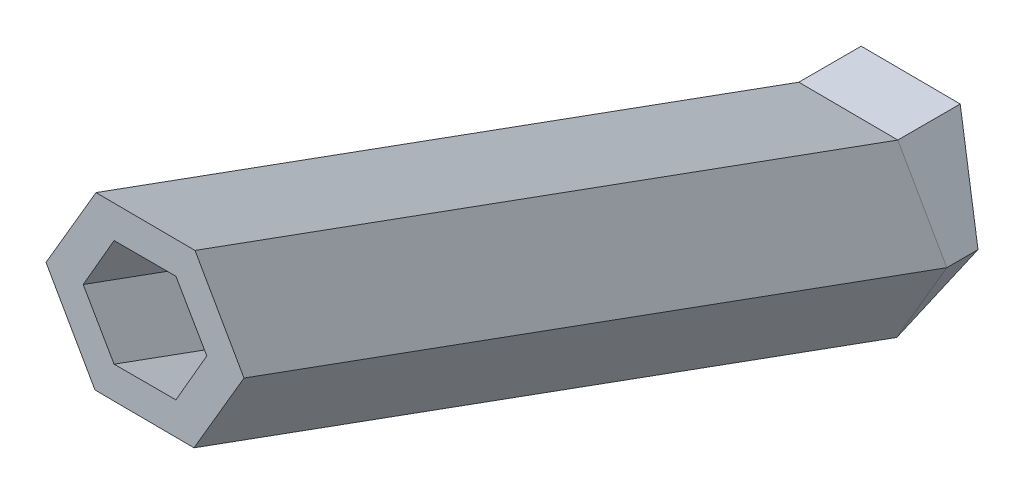
ISO-10303-21;
HEADER;
FILE_DESCRIPTION(('STEP AP214'),'2;1');
FILE_NAME('part.step','',(''),(''),'','','');
FILE_SCHEMA(('AUTOMOTIVE_DESIGN { 1 0 10303 214 1 1 1 1 }'));
ENDSEC;
DATA;
#1=APPLICATION_CONTEXT('core data for automotive mechanical design processes');
#2=APPLICATION_PROTOCOL_DEFINITION('international standard','automotive_design',2000,#1);
#3=PRODUCT_CONTEXT('',#1,'mechanical');
#4=PRODUCT('Part','Part','',(#3));
#5=PRODUCT_RELATED_PRODUCT_CATEGORY('part','',(#4));
#6=PRODUCT_DEFINITION_FORMATION('','',#4);
#7=PRODUCT_DEFINITION_CONTEXT('part definition',#1,'design');
#8=PRODUCT_DEFINITION('design','',#6,#7);
#9=PRODUCT_DEFINITION_SHAPE('','',#8);
#10=(LENGTH_UNIT() NAMED_UNIT(*) SI_UNIT(.MILLI.,.METRE.));
#11=(NAMED_UNIT(*) PLANE_ANGLE_UNIT() SI_UNIT($,.RADIAN.));
#12=(NAMED_UNIT(*) SI_UNIT($,.STERADIAN.) SOLID_ANGLE_UNIT());
#13=UNCERTAINTY_MEASURE_WITH_UNIT(LENGTH_MEASURE(1.E-05),#10,'distance_accuracy_value','');
#14=(GEOMETRIC_REPRESENTATION_CONTEXT(3) GLOBAL_UNCERTAINTY_ASSIGNED_CONTEXT((#13)) GLOBAL_UNIT_ASSIGNED_CONTEXT((#10,
#11,#12)) REPRESENTATION_CONTEXT('',''));
#15=CARTESIAN_POINT('',(0.,0.,0.));
#16=DIRECTION('',(0.,0.,1.));
#17=DIRECTION('',(1.,0.,0.));
#18=AXIS2_PLACEMENT_3D('',#15,#16,#17);
#19=CARTESIAN_POINT('',(3.64119484408319,-6.08441680588479,-28.1152363360501));
#20=DIRECTION('',(0.,1.,0.));
#21=DIRECTION('',(-1.,0.,0.));
#22=AXIS2_PLACEMENT_3D('',#19,#20,#21);
#23=PLANE('',#22);
#24=DIRECTION('',(0.999997626489176,0.,-0.00217876479115009));
#25=VECTOR('',#24,1.);
#26=CARTESIAN_POINT('',(3.71304453936352,-6.08441680588479,4.86194644024164));
#27=LINE('',#26,#25);
#28=CARTESIAN_POINT('',(-3.38448451739586,-6.0844168058847,4.87741032335837));
#29=VERTEX_POINT('',#28);
#30=CARTESIAN_POINT('',(3.64119484408319,-6.08441680588479,4.86210298419953));
#31=VERTEX_POINT('',#30);
#32=EDGE_CURVE('E53',#29,#31,#27,.T.);
#33=ORIENTED_EDGE('',*,*,#32,.F.);
#34=DIRECTION('',(0.,0.,1.));
#35=VECTOR('',#34,1.);
#36=CARTESIAN_POINT('',(-3.38448451739586,-6.0844168058847,-28.1152363360501));
#37=LINE('',#36,#35);
#38=CARTESIAN_POINT('',(-3.38448451739586,-6.0844168058847,6.20198748145939));
#39=VERTEX_POINT('',#38);
#40=EDGE_CURVE('E169',#29,#39,#37,.T.);
#41=ORIENTED_EDGE('',*,*,#40,.T.);
#42=DIRECTION('',(-1.,0.,0.));
#43=VECTOR('',#42,1.);
#44=CARTESIAN_POINT('',(3.64119484408319,-6.08441680588479,6.20198748145939));
#45=LINE('',#44,#43);
#46=CARTESIAN_POINT('',(3.64119484408319,-6.08441680588479,6.20198748145939));
#47=VERTEX_POINT('',#46);
#48=EDGE_CURVE('E158',#47,#39,#45,.T.);
#49=ORIENTED_EDGE('',*,*,#48,.F.);
#50=DIRECTION('',(0.,0.,1.));
#51=VECTOR('',#50,1.);
#52=CARTESIAN_POINT('',(3.64119484408319,-6.08441680588479,-28.1152363360501));
#53=LINE('',#52,#51);
#54=EDGE_CURVE('E171',#31,#47,#53,.T.);
#55=ORIENTED_EDGE('',*,*,#54,.F.);
#56=EDGE_LOOP('',(#33,#41,#49,#55));
#57=FACE_BOUND('',#56,.T.);
#58=ADVANCED_FACE('F49',(#57),#23,.T.);
#59=CARTESIAN_POINT('',(7.15403452482278,0.,-28.1152363360501));
#60=DIRECTION('',(-0.866025403784433,0.500000000000011,0.));
#61=DIRECTION('',(-0.500000000000011,-0.866025403784432,0.));
#62=AXIS2_PLACEMENT_3D('',#59,#60,#61);
#63=PLANE('',#62);
#64=DIRECTION('',(0.47672259943023,0.825707763329441,-0.301566332288565));
#65=VECTOR('',#64,1.);
#66=CARTESIAN_POINT('',(11.5755062246895,7.65821362839686,-0.157002854593496));
#67=LINE('',#66,#65);
#68=CARTESIAN_POINT('',(7.15403452482278,0.,2.63994238240617));
#69=VERTEX_POINT('',#68);
#70=EDGE_CURVE('E201',#31,#69,#67,.T.);
#71=ORIENTED_EDGE('',*,*,#70,.F.);
#72=ORIENTED_EDGE('',*,*,#54,.T.);
#73=DIRECTION('',(-0.500000000000011,-0.866025403784432,0.));
#74=VECTOR('',#73,1.);
#75=CARTESIAN_POINT('',(7.15403452482278,0.,6.20198748145939));
#76=LINE('',#75,#74);
#77=CARTESIAN_POINT('',(7.15403452482278,0.,6.20198748145939));
#78=VERTEX_POINT('',#77);
#79=EDGE_CURVE('E166',#78,#47,#76,.T.);
#80=ORIENTED_EDGE('',*,*,#79,.F.);
#81=DIRECTION('',(0.,0.,1.));
#82=VECTOR('',#81,1.);
#83=CARTESIAN_POINT('',(7.15403452482278,0.,-28.1152363360501));
#84=LINE('',#83,#82);
#85=EDGE_CURVE('E173',#69,#78,#84,.T.);
#86=ORIENTED_EDGE('',*,*,#85,.F.);
#87=EDGE_LOOP('',(#71,#72,#80,#86));
#88=FACE_BOUND('',#87,.T.);
#89=ADVANCED_FACE('F245',(#88),#63,.T.);
#90=CARTESIAN_POINT('',(3.64119484408333,6.08441680588498,-28.1152363360501));
#91=DIRECTION('',(-0.866025403784445,-0.499999999999989,0.));
#92=DIRECTION('',(0.49999999999999,-0.866025403784445,0.));
#93=AXIS2_PLACEMENT_3D('',#90,#91,#92);
#94=PLANE('',#93);
#95=DIRECTION('',(-0.47702049513201,0.826223733820326,-0.299676140017872));
#96=VECTOR('',#95,1.);
#97=CARTESIAN_POINT('',(-0.439835689761387,13.1529690377442,-2.1307157694485));
#98=LINE('',#97,#96);
#99=CARTESIAN_POINT('',(3.64119484408333,6.08441680588498,0.433089119771647));
#100=VERTEX_POINT('',#99);
#101=EDGE_CURVE('E205',#69,#100,#98,.T.);
#102=ORIENTED_EDGE('',*,*,#101,.F.);
#103=ORIENTED_EDGE('',*,*,#85,.T.);
#104=DIRECTION('',(0.499999999999989,-0.866025403784445,0.));
#105=VECTOR('',#104,1.);
#106=CARTESIAN_POINT('',(3.64119484408333,6.08441680588498,6.20198748145939));
#107=LINE('',#106,#105);
#108=CARTESIAN_POINT('',(3.64119484408333,6.08441680588498,6.20198748145939));
#109=VERTEX_POINT('',#108);
#110=EDGE_CURVE('E163',#109,#78,#107,.T.);
#111=ORIENTED_EDGE('',*,*,#110,.F.);
#112=DIRECTION('',(0.,0.,1.));
#113=VECTOR('',#112,1.);
#114=CARTESIAN_POINT('',(3.64119484408333,6.08441680588498,-28.1152363360501));
#115=LINE('',#114,#113);
#116=EDGE_CURVE('E175',#100,#109,#115,.T.);
#117=ORIENTED_EDGE('',*,*,#116,.F.);
#118=EDGE_LOOP('',(#102,#103,#111,#117));
#119=FACE_BOUND('',#118,.T.);
#120=ADVANCED_FACE('F251',(#119),#94,.T.);
#121=CARTESIAN_POINT('',(-3.38448451739571,6.08441680588506,-28.1152363360501));
#122=DIRECTION('',(0.,-1.,0.));
#123=DIRECTION('',(1.,0.,0.));
#124=AXIS2_PLACEMENT_3D('',#121,#122,#123);
#125=PLANE('',#124);
#126=DIRECTION('',(-0.999997626489176,0.,0.00217876479115041));
#127=VECTOR('',#126,1.);
#128=CARTESIAN_POINT('',(-3.32225122766639,6.08441680588506,0.448260866908155));
#129=LINE('',#128,#127);
#130=CARTESIAN_POINT('',(-3.38448451739571,6.08441680588506,0.448396458930484));
#131=VERTEX_POINT('',#130);
#132=EDGE_CURVE('E210',#100,#131,#129,.T.);
#133=ORIENTED_EDGE('',*,*,#132,.F.);
#134=ORIENTED_EDGE('',*,*,#116,.T.);
#135=DIRECTION('',(1.,0.,0.));
#136=VECTOR('',#135,1.);
#137=CARTESIAN_POINT('',(-3.38448451739571,6.08441680588506,6.20198748145939));
#138=LINE('',#137,#136);
#139=CARTESIAN_POINT('',(-3.38448451739571,6.08441680588506,6.20198748145939));
#140=VERTEX_POINT('',#139);
#141=EDGE_CURVE('E153',#140,#109,#138,.T.);
#142=ORIENTED_EDGE('',*,*,#141,.F.);
#143=DIRECTION('',(0.,0.,1.));
#144=VECTOR('',#143,1.);
#145=CARTESIAN_POINT('',(-3.38448451739571,6.08441680588506,-28.1152363360501));
#146=LINE('',#145,#144);
#147=EDGE_CURVE('E144',#131,#140,#146,.T.);
#148=ORIENTED_EDGE('',*,*,#147,.F.);
#149=EDGE_LOOP('',(#133,#134,#142,#148));
#150=FACE_BOUND('',#149,.T.);
#151=ADVANCED_FACE('F258',(#150),#125,.T.);
#152=CARTESIAN_POINT('',(-6.8973241981353,2.25011642967688E-13,-28.1152363360501));
#153=DIRECTION('',(0.866025403784432,-0.500000000000011,0.));
#154=DIRECTION('',(0.500000000000011,0.866025403784432,0.));
#155=AXIS2_PLACEMENT_3D('',#152,#153,#154);
#156=PLANE('',#155);
#157=DIRECTION('',(-0.47672259943023,-0.82570776332944,0.301566332288565));
#158=VECTOR('',#157,1.);
#159=CARTESIAN_POINT('',(-2.47145122539613,7.66583685663016,-0.129172344089865));
#160=LINE('',#159,#158);
#161=CARTESIAN_POINT('',(-6.89732419813531,2.24646690138997E-13,2.67055706072384));
#162=VERTEX_POINT('',#161);
#163=EDGE_CURVE('E214',#131,#162,#160,.T.);
#164=ORIENTED_EDGE('',*,*,#163,.F.);
#165=ORIENTED_EDGE('',*,*,#147,.T.);
#166=DIRECTION('',(0.500000000000011,0.866025403784432,0.));
#167=VECTOR('',#166,1.);
#168=CARTESIAN_POINT('',(-6.8973241981353,2.25011642967688E-13,6.20198748145939));
#169=LINE('',#168,#167);
#170=CARTESIAN_POINT('',(-6.8973241981353,2.25011642967688E-13,6.20198748145939));
#171=VERTEX_POINT('',#170);
#172=EDGE_CURVE('E147',#171,#140,#169,.T.);
#173=ORIENTED_EDGE('',*,*,#172,.F.);
#174=DIRECTION('',(0.,0.,1.));
#175=VECTOR('',#174,1.);
#176=CARTESIAN_POINT('',(-6.8973241981353,2.25011642967688E-13,-28.1152363360501));
#177=LINE('',#176,#175);
#178=EDGE_CURVE('E133',#162,#171,#177,.T.);
#179=ORIENTED_EDGE('',*,*,#178,.F.);
#180=EDGE_LOOP('',(#164,#165,#173,#179));
#181=FACE_BOUND('',#180,.T.);
#182=ADVANCED_FACE('F148',(#181),#156,.T.);
#183=CARTESIAN_POINT('',(-3.38448451739586,-6.0844168058847,-28.1152363360501));
#184=DIRECTION('',(0.866025403784445,0.499999999999989,0.));
#185=DIRECTION('',(-0.499999999999989,0.866025403784445,0.));
#186=AXIS2_PLACEMENT_3D('',#183,#184,#185);
#187=PLANE('',#186);
#188=DIRECTION('',(0.477020495132009,-0.826223733820326,0.299676140017872));
#189=VECTOR('',#188,1.);
#190=CARTESIAN_POINT('',(-8.10083814793563,2.08454730867235,1.91447966234284));
#191=LINE('',#190,#189);
#192=EDGE_CURVE('E140',#162,#29,#191,.T.);
#193=ORIENTED_EDGE('',*,*,#192,.F.);
#194=ORIENTED_EDGE('',*,*,#178,.T.);
#195=DIRECTION('',(-0.499999999999989,0.866025403784445,0.));
#196=VECTOR('',#195,1.);
#197=CARTESIAN_POINT('',(-3.38448451739586,-6.0844168058847,6.20198748145939));
#198=LINE('',#197,#196);
#199=EDGE_CURVE('E138',#39,#171,#198,.T.);
#200=ORIENTED_EDGE('',*,*,#199,.F.);
#201=ORIENTED_EDGE('',*,*,#40,.F.);
#202=EDGE_LOOP('',(#193,#194,#200,#201));
#203=FACE_BOUND('',#202,.T.);
#204=ADVANCED_FACE('F135',(#203),#187,.T.);
#205=CARTESIAN_POINT('',(-5.55591327185152,-9.71072917481277,-28.1152363360501));
#206=DIRECTION('',(0.869002947857794,0.494806908414245,0.));
#207=DIRECTION('',(-0.494806908414245,0.869002947857794,0.));
#208=AXIS2_PLACEMENT_3D('',#205,#206,#207);
#209=PLANE('',#208);
#210=DIRECTION('',(0.,0.,1.));
#211=VECTOR('',#210,1.);
#212=CARTESIAN_POINT('',(-11.1235172089126,0.0673562794028021,-28.1152363360501));
#213=LINE('',#212,#211);
#214=CARTESIAN_POINT('',(-11.1235172089126,0.0673562794028021,2.65524972156502));
#215=VERTEX_POINT('',#214);
#216=CARTESIAN_POINT('',(-11.1235172089126,0.0673562794028021,6.20198748145939));
#217=VERTEX_POINT('',#216);
#218=EDGE_CURVE('E195',#215,#217,#213,.T.);
#219=ORIENTED_EDGE('',*,*,#218,.F.);
#220=DIRECTION('',(0.471918093543578,-0.82880454468811,0.300626578483223));
#221=VECTOR('',#220,1.);
#222=CARTESIAN_POINT('',(-10.4245363114342,-1.16022654144267,3.10052240449225));
#223=LINE('',#222,#221);
#224=CARTESIAN_POINT('',(-5.55591327185152,-9.71072917481277,6.20198748145939));
#225=VERTEX_POINT('',#224);
#226=EDGE_CURVE('E217',#215,#225,#223,.T.);
#227=ORIENTED_EDGE('',*,*,#226,.T.);
#228=DIRECTION('',(-0.494806908414245,0.869002947857794,0.));
#229=VECTOR('',#228,1.);
#230=CARTESIAN_POINT('',(-5.55591327185152,-9.71072917481277,6.20198748145939));
#231=LINE('',#230,#229);
#232=EDGE_CURVE('E189',#225,#217,#231,.T.);
#233=ORIENTED_EDGE('',*,*,#232,.T.);
#234=EDGE_LOOP('',(#219,#227,#233));
#235=FACE_BOUND('',#234,.T.);
#236=ADVANCED_FACE('F236',(#235),#209,.F.);
#237=CARTESIAN_POINT('',(0.,0.,6.20198748145939));
#238=DIRECTION('',(0.,0.,-1.));
#239=DIRECTION('',(-1.,0.,0.));
#240=AXIS2_PLACEMENT_3D('',#237,#238,#239);
#241=PLANE('',#240);
#242=DIRECTION('',(0.50517517460129,0.863016826583674,0.));
#243=VECTOR('',#242,1.);
#244=CARTESIAN_POINT('',(-11.1235172089126,0.0673562794028021,6.20198748145939));
#245=LINE('',#244,#243);
#246=CARTESIAN_POINT('',(-5.43924877371731,9.77808545421571,6.20198748145939));
#247=VERTEX_POINT('',#246);
#248=EDGE_CURVE('E143',#217,#247,#245,.T.);
#249=ORIENTED_EDGE('',*,*,#248,.F.);
#250=ORIENTED_EDGE('',*,*,#232,.F.);
#251=DIRECTION('',(-0.999982083015537,0.00598612127412063,0.));
#252=VECTOR('',#251,1.);
#253=CARTESIAN_POINT('',(5.69595910040478,-9.77808545421543,6.20198748145939));
#254=LINE('',#253,#252);
#255=CARTESIAN_POINT('',(5.69595910040478,-9.77808545421543,6.20198748145939));
#256=VERTEX_POINT('',#255);
#257=EDGE_CURVE('E190',#256,#225,#254,.T.);
#258=ORIENTED_EDGE('',*,*,#257,.F.);
#259=DIRECTION('',(-0.505175174601291,-0.863016826583674,0.));
#260=VECTOR('',#259,1.);
#261=CARTESIAN_POINT('',(11.3802275356,-0.0673562794025248,6.20198748145939));
#262=LINE('',#261,#260);
#263=CARTESIAN_POINT('',(11.3802275356,-0.0673562794025248,6.20198748145939));
#264=VERTEX_POINT('',#263);
#265=EDGE_CURVE('E186',#264,#256,#262,.T.);
#266=ORIENTED_EDGE('',*,*,#265,.F.);
#267=DIRECTION('',(0.494806908414245,-0.869002947857795,0.));
#268=VECTOR('',#267,1.);
#269=CARTESIAN_POINT('',(5.812623598539,9.71072917481305,6.20198748145939));
#270=LINE('',#269,#268);
#271=CARTESIAN_POINT('',(5.812623598539,9.71072917481305,6.20198748145939));
#272=VERTEX_POINT('',#271);
#273=EDGE_CURVE('E183',#272,#264,#270,.T.);
#274=ORIENTED_EDGE('',*,*,#273,.F.);
#275=DIRECTION('',(0.999982083015537,-0.00598612127412032,0.));
#276=VECTOR('',#275,1.);
#277=CARTESIAN_POINT('',(-5.43924877371731,9.77808545421571,6.20198748145939));
#278=LINE('',#277,#276);
#279=EDGE_CURVE('E180',#247,#272,#278,.T.);
#280=ORIENTED_EDGE('',*,*,#279,.F.);
#281=EDGE_LOOP('',(#249,#250,#258,#266,#274,#280));
#282=FACE_BOUND('',#281,.T.);
#283=ORIENTED_EDGE('',*,*,#199,.T.);
#284=ORIENTED_EDGE('',*,*,#172,.T.);
#285=ORIENTED_EDGE('',*,*,#141,.T.);
#286=ORIENTED_EDGE('',*,*,#110,.T.);
#287=ORIENTED_EDGE('',*,*,#79,.T.);
#288=ORIENTED_EDGE('',*,*,#48,.T.);
#289=EDGE_LOOP('',(#283,#284,#285,#286,#287,#288));
#290=FACE_BOUND('',#289,.T.);
#291=ADVANCED_FACE('F155',(#282,#290),#241,.F.);
#292=CARTESIAN_POINT('',(11.3802275356,-0.0673562794025248,-28.1152363360501));
#293=DIRECTION('',(-0.863016826583674,0.505175174601291,0.));
#294=DIRECTION('',(-0.505175174601291,-0.863016826583674,0.));
#295=AXIS2_PLACEMENT_3D('',#292,#293,#294);
#296=PLANE('',#295);
#297=ORIENTED_EDGE('',*,*,#265,.T.);
#298=DIRECTION('',(0.481806743700109,0.823095329858315,-0.300626578483224));
#299=VECTOR('',#298,1.);
#300=CARTESIAN_POINT('',(15.8371451364416,7.54662611246573,-0.125674178820742));
#301=LINE('',#300,#299);
#302=CARTESIAN_POINT('',(11.3802275356,-0.0673562794025256,2.65524972156499));
#303=VERTEX_POINT('',#302);
#304=EDGE_CURVE('E192',#256,#303,#301,.T.);
#305=ORIENTED_EDGE('',*,*,#304,.T.);
#306=DIRECTION('',(0.,0.,1.));
#307=VECTOR('',#306,1.);
#308=CARTESIAN_POINT('',(11.3802275356,-0.0673562794025248,-28.1152363360501));
#309=LINE('',#308,#307);
#310=EDGE_CURVE('E197',#303,#264,#309,.T.);
#311=ORIENTED_EDGE('',*,*,#310,.T.);
#312=EDGE_LOOP('',(#297,#305,#311));
#313=FACE_BOUND('',#312,.T.);
#314=ADVANCED_FACE('F228',(#313),#296,.F.);
#315=CARTESIAN_POINT('',(5.812623598539,9.71072917481305,-28.1152363360501));
#316=DIRECTION('',(-0.869002947857795,-0.494806908414245,0.));
#317=DIRECTION('',(0.494806908414245,-0.869002947857795,0.));
#318=AXIS2_PLACEMENT_3D('',#315,#316,#317);
#319=PLANE('',#318);
#320=ORIENTED_EDGE('',*,*,#310,.F.);
#321=DIRECTION('',(-0.471918093543578,0.82880454468811,-0.300626578483223));
#322=VECTOR('',#321,1.);
#323=CARTESIAN_POINT('',(1.95035988831264,16.4938166631167,-3.35187076213368));
#324=LINE('',#323,#322);
#325=CARTESIAN_POINT('',(5.812623598539,9.71072917481305,-0.891488038329402));
#326=VERTEX_POINT('',#325);
#327=EDGE_CURVE('E70',#303,#326,#324,.T.);
#328=ORIENTED_EDGE('',*,*,#327,.T.);
#329=DIRECTION('',(0.,0.,1.));
#330=VECTOR('',#329,1.);
#331=CARTESIAN_POINT('',(5.812623598539,9.71072917481305,-28.1152363360501));
#332=LINE('',#331,#330);
#333=EDGE_CURVE('E199',#326,#272,#332,.T.);
#334=ORIENTED_EDGE('',*,*,#333,.T.);
#335=ORIENTED_EDGE('',*,*,#273,.T.);
#336=EDGE_LOOP('',(#320,#328,#334,#335));
#337=FACE_BOUND('',#336,.T.);
#338=ADVANCED_FACE('F225',(#337),#319,.F.);
#339=CARTESIAN_POINT('',(-5.43924877371731,9.77808545421571,-28.1152363360501));
#340=DIRECTION('',(-0.00598612127412032,-0.999982083015537,0.));
#341=DIRECTION('',(0.999982083015537,-0.00598612127412032,0.));
#342=AXIS2_PLACEMENT_3D('',#339,#340,#341);
#343=PLANE('',#342);
#344=ORIENTED_EDGE('',*,*,#333,.F.);
#345=DIRECTION('',(-0.999982083015537,0.00598612127412032,0.));
#346=VECTOR('',#345,1.);
#347=CARTESIAN_POINT('',(-5.43924877371728,9.77808545421571,-0.891488038329384));
#348=LINE('',#347,#346);
#349=CARTESIAN_POINT('',(-5.43924877371731,9.77808545421571,-0.891488038329384));
#350=VERTEX_POINT('',#349);
#351=EDGE_CURVE('E58',#326,#350,#348,.T.);
#352=ORIENTED_EDGE('',*,*,#351,.T.);
#353=DIRECTION('',(0.,0.,1.));
#354=VECTOR('',#353,1.);
#355=CARTESIAN_POINT('',(-5.43924877371731,9.77808545421571,-28.1152363360501));
#356=LINE('',#355,#354);
#357=EDGE_CURVE('E200',#350,#247,#356,.T.);
#358=ORIENTED_EDGE('',*,*,#357,.T.);
#359=ORIENTED_EDGE('',*,*,#279,.T.);
#360=EDGE_LOOP('',(#344,#352,#358,#359));
#361=FACE_BOUND('',#360,.T.);
#362=ADVANCED_FACE('F222',(#361),#343,.F.);
#363=CARTESIAN_POINT('',(-11.1235172089126,0.0673562794028021,-28.1152363360501));
#364=DIRECTION('',(0.863016826583674,-0.50517517460129,0.));
#365=DIRECTION('',(0.50517517460129,0.863016826583674,0.));
#366=AXIS2_PLACEMENT_3D('',#363,#364,#365);
#367=PLANE('',#366);
#368=ORIENTED_EDGE('',*,*,#357,.F.);
#369=DIRECTION('',(-0.481806743700108,-0.823095329858315,0.300626578483224));
#370=VECTOR('',#369,1.);
#371=CARTESIAN_POINT('',(-6.66659960807101,7.68133867127107,-0.125674178820718));
#372=LINE('',#371,#370);
#373=EDGE_CURVE('E12',#350,#215,#372,.T.);
#374=ORIENTED_EDGE('',*,*,#373,.T.);
#375=ORIENTED_EDGE('',*,*,#218,.T.);
#376=ORIENTED_EDGE('',*,*,#248,.T.);
#377=EDGE_LOOP('',(#368,#374,#375,#376));
#378=FACE_BOUND('',#377,.T.);
#379=ADVANCED_FACE('F51',(#378),#367,.F.);
#380=CARTESIAN_POINT('',(0.301442633391118,28.7410450302987,-7.80582486143679));
#381=DIRECTION('',(0.00204737405614056,0.342014015356076,0.939692620785908));
#382=DIRECTION('',(-0.00562511398842395,-0.939675784327821,0.34202014332567));
#383=AXIS2_PLACEMENT_3D('',#380,#381,#382);
#384=PLANE('',#383);
#385=ORIENTED_EDGE('',*,*,#192,.T.);
#386=ORIENTED_EDGE('',*,*,#32,.T.);
#387=ORIENTED_EDGE('',*,*,#70,.T.);
#388=ORIENTED_EDGE('',*,*,#101,.T.);
#389=ORIENTED_EDGE('',*,*,#132,.T.);
#390=ORIENTED_EDGE('',*,*,#163,.T.);
#391=EDGE_LOOP('',(#385,#386,#387,#388,#389,#390));
#392=FACE_BOUND('',#391,.T.);
#393=ORIENTED_EDGE('',*,*,#351,.F.);
#394=ORIENTED_EDGE('',*,*,#327,.F.);
#395=ORIENTED_EDGE('',*,*,#304,.F.);
#396=ORIENTED_EDGE('',*,*,#257,.T.);
#397=ORIENTED_EDGE('',*,*,#226,.F.);
#398=ORIENTED_EDGE('',*,*,#373,.F.);
#399=EDGE_LOOP('',(#393,#394,#395,#396,#397,#398));
#400=FACE_BOUND('',#399,.T.);
#401=ADVANCED_FACE('F230',(#392,#400),#384,.F.);
#402=CLOSED_SHELL('',(#58,#89,#120,#151,#182,#204,#236,#291,#314,#338,#362,#379,#401));
#403=MANIFOLD_SOLID_BREP('B2',#402);
#404=CARTESIAN_POINT('',(0.128355163343738,1.38763360146466E-13,6.20198748145939));
#405=DIRECTION('',(0.,0.,1.));
#406=DIRECTION('',(1.,0.,0.));
#407=AXIS2_PLACEMENT_3D('',#404,#405,#406);
#408=PLANE('',#407);
#409=DIRECTION('',(1.,0.,0.));
#410=VECTOR('',#409,1.);
#411=CARTESIAN_POINT('',(3.64119484408319,-6.08441680588479,6.20198748145939));
#412=LINE('',#411,#410);
#413=CARTESIAN_POINT('',(-3.38448451739586,-6.0844168058847,6.20198748145939));
#414=VERTEX_POINT('',#413);
#415=CARTESIAN_POINT('',(3.64119484408319,-6.08441680588479,6.20198748145939));
#416=VERTEX_POINT('',#415);
#417=EDGE_CURVE('E482',#414,#416,#412,.T.);
#418=ORIENTED_EDGE('',*,*,#417,.T.);
#419=DIRECTION('',(0.500000000000011,0.866025403784432,0.));
#420=VECTOR('',#419,1.);
#421=CARTESIAN_POINT('',(6.99580116644336,-0.274068216165352,6.20198748145939));
#422=LINE('',#421,#420);
#423=CARTESIAN_POINT('',(7.15403452482278,0.,6.20198748145939));
#424=VERTEX_POINT('',#423);
#425=EDGE_CURVE('E453',#416,#424,#422,.T.);
#426=ORIENTED_EDGE('',*,*,#425,.T.);
#427=DIRECTION('',(-0.499999999999989,0.866025403784445,0.));
#428=VECTOR('',#427,1.);
#429=CARTESIAN_POINT('',(3.79942820246275,5.81034858971957,6.20198748145939));
#430=LINE('',#429,#428);
#431=CARTESIAN_POINT('',(3.64119484408333,6.08441680588498,6.20198748145939));
#432=VERTEX_POINT('',#431);
#433=EDGE_CURVE('E450',#424,#432,#430,.T.);
#434=ORIENTED_EDGE('',*,*,#433,.T.);
#435=DIRECTION('',(-1.,0.,0.));
#436=VECTOR('',#435,1.);
#437=CARTESIAN_POINT('',(-3.3844845173957,6.08441680588507,6.20198748145939));
#438=LINE('',#437,#436);
#439=CARTESIAN_POINT('',(-3.38448451739571,6.08441680588506,6.20198748145937));
#440=VERTEX_POINT('',#439);
#441=EDGE_CURVE('E476',#432,#440,#438,.T.);
#442=ORIENTED_EDGE('',*,*,#441,.T.);
#443=DIRECTION('',(-0.500000000000011,-0.866025403784432,0.));
#444=VECTOR('',#443,1.);
#445=CARTESIAN_POINT('',(-7.05555755651473,-0.274068216165179,6.20198748145939));
#446=LINE('',#445,#444);
#447=CARTESIAN_POINT('',(-6.8973241981353,2.25011642967688E-13,6.20198748145939));
#448=VERTEX_POINT('',#447);
#449=EDGE_CURVE('E475',#440,#448,#446,.T.);
#450=ORIENTED_EDGE('',*,*,#449,.T.);
#451=DIRECTION('',(0.499999999999989,-0.866025403784445,0.));
#452=VECTOR('',#451,1.);
#453=CARTESIAN_POINT('',(-3.22625115901644,-6.35848502205012,6.20198748145939));
#454=LINE('',#453,#452);
#455=EDGE_CURVE('E479',#448,#414,#454,.T.);
#456=ORIENTED_EDGE('',*,*,#455,.T.);
#457=EDGE_LOOP('',(#418,#426,#434,#442,#450,#456));
#458=FACE_BOUND('',#457,.T.);
#459=DIRECTION('',(-0.999982083015537,0.00598612127412032,0.));
#460=VECTOR('',#459,1.);
#461=CARTESIAN_POINT('',(5.812623598539,9.71072917481305,6.20198748145939));
#462=LINE('',#461,#460);
#463=CARTESIAN_POINT('',(5.812623598539,9.71072917481305,6.20198748145939));
#464=VERTEX_POINT('',#463);
#465=CARTESIAN_POINT('',(-5.43924877371731,9.77808545421571,6.20198748145939));
#466=VERTEX_POINT('',#465);
#467=EDGE_CURVE('E460',#464,#466,#462,.T.);
#468=ORIENTED_EDGE('',*,*,#467,.F.);
#469=DIRECTION('',(-0.494806908414245,0.869002947857795,0.));
#470=VECTOR('',#469,1.);
#471=CARTESIAN_POINT('',(11.3802275356,-0.0673562794025248,6.20198748145939));
#472=LINE('',#471,#470);
#473=CARTESIAN_POINT('',(11.3802275356,-0.0673562794025248,6.20198748145939));
#474=VERTEX_POINT('',#473);
#475=EDGE_CURVE('E496',#474,#464,#472,.T.);
#476=ORIENTED_EDGE('',*,*,#475,.F.);
#477=DIRECTION('',(0.505175174601291,0.863016826583674,0.));
#478=VECTOR('',#477,1.);
#479=CARTESIAN_POINT('',(5.69595910040478,-9.77808545421543,6.20198748145939));
#480=LINE('',#479,#478);
#481=CARTESIAN_POINT('',(5.69595910040478,-9.77808545421543,6.20198748145939));
#482=VERTEX_POINT('',#481);
#483=EDGE_CURVE('E515',#482,#474,#480,.T.);
#484=ORIENTED_EDGE('',*,*,#483,.F.);
#485=DIRECTION('',(0.999982083015537,-0.00598612127412063,0.));
#486=VECTOR('',#485,1.);
#487=CARTESIAN_POINT('',(-5.55591327185152,-9.71072917481277,6.20198748145939));
#488=LINE('',#487,#486);
#489=CARTESIAN_POINT('',(-5.55591327185152,-9.71072917481277,6.20198748145939));
#490=VERTEX_POINT('',#489);
#491=EDGE_CURVE('E507',#490,#482,#488,.T.);
#492=ORIENTED_EDGE('',*,*,#491,.F.);
#493=DIRECTION('',(0.494806908414245,-0.869002947857794,0.));
#494=VECTOR('',#493,1.);
#495=CARTESIAN_POINT('',(-11.1235172089126,0.0673562794028021,6.20198748145939));
#496=LINE('',#495,#494);
#497=CARTESIAN_POINT('',(-11.1235172089126,0.0673562794028021,6.20198748145939));
#498=VERTEX_POINT('',#497);
#499=EDGE_CURVE('E499',#498,#490,#496,.T.);
#500=ORIENTED_EDGE('',*,*,#499,.F.);
#501=DIRECTION('',(-0.50517517460129,-0.863016826583674,0.));
#502=VECTOR('',#501,1.);
#503=CARTESIAN_POINT('',(-5.43924877371731,9.77808545421571,6.20198748145939));
#504=LINE('',#503,#502);
#505=EDGE_CURVE('E486',#466,#498,#504,.T.);
#506=ORIENTED_EDGE('',*,*,#505,.F.);
#507=EDGE_LOOP('',(#468,#476,#484,#492,#500,#506));
#508=FACE_BOUND('',#507,.T.);
#509=ADVANCED_FACE('F357',(#458,#508),#408,.F.);
#510=CARTESIAN_POINT('',(0.128355163343738,29.0717121826812,86.0758602482619));
#511=DIRECTION('',(0.,0.,1.));
#512=DIRECTION('',(1.,0.,0.));
#513=AXIS2_PLACEMENT_3D('',#510,#511,#512);
#514=PLANE('',#513);
#515=DIRECTION('',(-0.499999999999989,0.866025403784445,0.));
#516=VECTOR('',#515,1.);
#517=CARTESIAN_POINT('',(16.3878488433183,13.0782766353895,86.0758602482619));
#518=LINE('',#517,#516);
#519=CARTESIAN_POINT('',(7.15403452482278,29.0717121826812,86.0758602482619));
#520=VERTEX_POINT('',#519);
#521=CARTESIAN_POINT('',(3.64119484408333,35.1561289885661,86.0758602482619));
#522=VERTEX_POINT('',#521);
#523=EDGE_CURVE('E447',#520,#522,#518,.T.);
#524=ORIENTED_EDGE('',*,*,#523,.F.);
#525=DIRECTION('',(0.500000000000011,0.866025403784432,0.));
#526=VECTOR('',#525,1.);
#527=CARTESIAN_POINT('',(-5.59261947441254,6.99385982950525,86.0758602482619));
#528=LINE('',#527,#526);
#529=CARTESIAN_POINT('',(3.64119484408319,22.9872953767964,86.0758602482619));
#530=VERTEX_POINT('',#529);
#531=EDGE_CURVE('E456',#530,#520,#528,.T.);
#532=ORIENTED_EDGE('',*,*,#531,.F.);
#533=DIRECTION('',(1.,0.,0.));
#534=VECTOR('',#533,1.);
#535=CARTESIAN_POINT('',(3.64119484408355,22.9872953767964,86.0758602482619));
#536=LINE('',#535,#534);
#537=CARTESIAN_POINT('',(-3.38448451739586,22.9872953767964,86.0758602482619));
#538=VERTEX_POINT('',#537);
#539=EDGE_CURVE('E379',#538,#530,#536,.T.);
#540=ORIENTED_EDGE('',*,*,#539,.F.);
#541=DIRECTION('',(0.499999999999989,-0.866025403784445,0.));
#542=VECTOR('',#541,1.);
#543=CARTESIAN_POINT('',(9.36216948183909,0.909443023619861,86.0758602482619));
#544=LINE('',#543,#542);
#545=CARTESIAN_POINT('',(-6.8973241981353,29.0717121826814,86.0758602482619));
#546=VERTEX_POINT('',#545);
#547=EDGE_CURVE('E673',#546,#538,#544,.T.);
#548=ORIENTED_EDGE('',*,*,#547,.F.);
#549=DIRECTION('',(-0.500000000000011,-0.866025403784432,0.));
#550=VECTOR('',#549,1.);
#551=CARTESIAN_POINT('',(-19.6439781973706,6.99385982950542,86.0758602482619));
#552=LINE('',#551,#550);
#553=CARTESIAN_POINT('',(-3.38448451739571,35.1561289885662,86.0758602482619));
#554=VERTEX_POINT('',#553);
#555=EDGE_CURVE('E468',#554,#546,#552,.T.);
#556=ORIENTED_EDGE('',*,*,#555,.F.);
#557=DIRECTION('',(-1.,0.,0.));
#558=VECTOR('',#557,1.);
#559=CARTESIAN_POINT('',(-3.38448451739535,35.1561289885662,86.0758602482619));
#560=LINE('',#559,#558);
#561=EDGE_CURVE('E466',#522,#554,#560,.T.);
#562=ORIENTED_EDGE('',*,*,#561,.F.);
#563=EDGE_LOOP('',(#524,#532,#540,#548,#556,#562));
#564=FACE_BOUND('',#563,.T.);
#565=DIRECTION('',(-0.999982083015537,0.00598612127412032,0.));
#566=VECTOR('',#565,1.);
#567=CARTESIAN_POINT('',(5.812623598539,38.7824413574941,86.0758602482619));
#568=LINE('',#567,#566);
#569=CARTESIAN_POINT('',(5.812623598539,38.7824413574941,86.0758602482619));
#570=VERTEX_POINT('',#569);
#571=CARTESIAN_POINT('',(-5.43924877371731,38.8497976368968,86.0758602482619));
#572=VERTEX_POINT('',#571);
#573=EDGE_CURVE('E487',#570,#572,#568,.T.);
#574=ORIENTED_EDGE('',*,*,#573,.T.);
#575=DIRECTION('',(-0.50517517460129,-0.863016826583674,0.));
#576=VECTOR('',#575,1.);
#577=CARTESIAN_POINT('',(-5.43924877371731,38.8497976368968,86.0758602482619));
#578=LINE('',#577,#576);
#579=CARTESIAN_POINT('',(-11.1235172089126,29.1390684620839,86.0758602482619));
#580=VERTEX_POINT('',#579);
#581=EDGE_CURVE('E493',#572,#580,#578,.T.);
#582=ORIENTED_EDGE('',*,*,#581,.T.);
#583=DIRECTION('',(0.494806908414245,-0.869002947857794,0.));
#584=VECTOR('',#583,1.);
#585=CARTESIAN_POINT('',(-11.1235172089126,29.1390684620839,86.0758602482619));
#586=LINE('',#585,#584);
#587=CARTESIAN_POINT('',(-5.55591327185152,19.3609830078683,86.0758602482619));
#588=VERTEX_POINT('',#587);
#589=EDGE_CURVE('E504',#580,#588,#586,.T.);
#590=ORIENTED_EDGE('',*,*,#589,.T.);
#591=DIRECTION('',(0.999982083015537,-0.00598612127412063,0.));
#592=VECTOR('',#591,1.);
#593=CARTESIAN_POINT('',(-5.55591327185152,19.3609830078683,86.0758602482619));
#594=LINE('',#593,#592);
#595=CARTESIAN_POINT('',(5.69595910040478,19.2936267284657,86.0758602482619));
#596=VERTEX_POINT('',#595);
#597=EDGE_CURVE('E512',#588,#596,#594,.T.);
#598=ORIENTED_EDGE('',*,*,#597,.T.);
#599=DIRECTION('',(0.505175174601291,0.863016826583674,0.));
#600=VECTOR('',#599,1.);
#601=CARTESIAN_POINT('',(5.69595910040478,19.2936267284657,86.0758602482619));
#602=LINE('',#601,#600);
#603=CARTESIAN_POINT('',(11.3802275356,29.0043559032786,86.0758602482619));
#604=VERTEX_POINT('',#603);
#605=EDGE_CURVE('E520',#596,#604,#602,.T.);
#606=ORIENTED_EDGE('',*,*,#605,.T.);
#607=DIRECTION('',(-0.494806908414245,0.869002947857795,0.));
#608=VECTOR('',#607,1.);
#609=CARTESIAN_POINT('',(11.3802275356,29.0043559032786,86.0758602482619));
#610=LINE('',#609,#608);
#611=EDGE_CURVE('E47',#604,#570,#610,.T.);
#612=ORIENTED_EDGE('',*,*,#611,.T.);
#613=EDGE_LOOP('',(#574,#582,#590,#598,#606,#612));
#614=FACE_BOUND('',#613,.T.);
#615=ADVANCED_FACE('F462',(#564,#614),#514,.T.);
#616=CARTESIAN_POINT('',(5.812623598539,9.71072917481305,6.20198748145939));
#617=DIRECTION('',(0.00562512577796662,0.939677753772549,-0.342014732175324));
#618=DIRECTION('',(0.,0.34202014332566,0.939692620785912));
#619=AXIS2_PLACEMENT_3D('',#616,#617,#618);
#620=PLANE('',#619);
#621=DIRECTION('',(0.,0.34202014332566,0.939692620785912));
#622=VECTOR('',#621,1.);
#623=CARTESIAN_POINT('',(-5.43924877371731,9.77808545421571,6.20198748145939));
#624=LINE('',#623,#622);
#625=EDGE_CURVE('E489',#466,#572,#624,.T.);
#626=ORIENTED_EDGE('',*,*,#625,.T.);
#627=ORIENTED_EDGE('',*,*,#573,.F.);
#628=DIRECTION('',(0.,0.34202014332566,0.939692620785912));
#629=VECTOR('',#628,1.);
#630=CARTESIAN_POINT('',(5.812623598539,9.71072917481305,6.20198748145939));
#631=LINE('',#630,#629);
#632=EDGE_CURVE('E490',#464,#570,#631,.T.);
#633=ORIENTED_EDGE('',*,*,#632,.F.);
#634=ORIENTED_EDGE('',*,*,#467,.T.);
#635=EDGE_LOOP('',(#626,#627,#633,#634));
#636=FACE_BOUND('',#635,.T.);
#637=ADVANCED_FACE('F534',(#636),#620,.T.);
#638=CARTESIAN_POINT('',(-5.43924877371731,9.77808545421571,6.20198748145939));
#639=DIRECTION('',(-0.848788291898737,0.496846365391118,-0.180837288005711));
#640=DIRECTION('',(-0.50517517460129,-0.863016826583675,0.));
#641=AXIS2_PLACEMENT_3D('',#638,#639,#640);
#642=PLANE('',#641);
#643=DIRECTION('',(0.,0.34202014332566,0.939692620785912));
#644=VECTOR('',#643,1.);
#645=CARTESIAN_POINT('',(-11.1235172089126,0.0673562794028021,6.20198748145939));
#646=LINE('',#645,#644);
#647=EDGE_CURVE('E501',#498,#580,#646,.T.);
#648=ORIENTED_EDGE('',*,*,#647,.T.);
#649=ORIENTED_EDGE('',*,*,#581,.F.);
#650=ORIENTED_EDGE('',*,*,#625,.F.);
#651=ORIENTED_EDGE('',*,*,#505,.T.);
#652=EDGE_LOOP('',(#648,#649,#650,#651));
#653=FACE_BOUND('',#652,.T.);
#654=ADVANCED_FACE('F539',(#653),#642,.T.);
#655=CARTESIAN_POINT('',(-11.1235172089126,0.0673562794028021,6.20198748145939));
#656=DIRECTION('',(-0.855244042473658,-0.486972641047177,0.177243546243167));
#657=DIRECTION('',(0.494806908414245,-0.869002947857794,0.));
#658=AXIS2_PLACEMENT_3D('',#655,#656,#657);
#659=PLANE('',#658);
#660=DIRECTION('',(0.,0.34202014332566,0.939692620785912));
#661=VECTOR('',#660,1.);
#662=CARTESIAN_POINT('',(-5.55591327185152,-9.71072917481277,6.20198748145939));
#663=LINE('',#662,#661);
#664=EDGE_CURVE('E509',#490,#588,#663,.T.);
#665=ORIENTED_EDGE('',*,*,#664,.T.);
#666=ORIENTED_EDGE('',*,*,#589,.F.);
#667=ORIENTED_EDGE('',*,*,#647,.F.);
#668=ORIENTED_EDGE('',*,*,#499,.T.);
#669=EDGE_LOOP('',(#665,#666,#667,#668));
#670=FACE_BOUND('',#669,.T.);
#671=ADVANCED_FACE('F542',(#670),#659,.T.);
#672=CARTESIAN_POINT('',(-5.55591327185152,-9.71072917481277,6.20198748145939));
#673=DIRECTION('',(-0.00562512577796692,-0.939677753772549,0.342014732175324));
#674=DIRECTION('',(0.,-0.34202014332566,-0.939692620785912));
#675=AXIS2_PLACEMENT_3D('',#672,#673,#674);
#676=PLANE('',#675);
#677=DIRECTION('',(0.,0.34202014332566,0.939692620785912));
#678=VECTOR('',#677,1.);
#679=CARTESIAN_POINT('',(5.69595910040478,-9.77808545421543,6.20198748145939));
#680=LINE('',#679,#678);
#681=EDGE_CURVE('E517',#482,#596,#680,.T.);
#682=ORIENTED_EDGE('',*,*,#681,.T.);
#683=ORIENTED_EDGE('',*,*,#597,.F.);
#684=ORIENTED_EDGE('',*,*,#664,.F.);
#685=ORIENTED_EDGE('',*,*,#491,.T.);
#686=EDGE_LOOP('',(#682,#683,#684,#685));
#687=FACE_BOUND('',#686,.T.);
#688=ADVANCED_FACE('F547',(#687),#676,.T.);
#689=CARTESIAN_POINT('',(5.69595910040478,-9.77808545421543,6.20198748145939));
#690=DIRECTION('',(0.848788291898736,-0.496846365391119,0.180837288005711));
#691=DIRECTION('',(0.505175174601291,0.863016826583674,0.));
#692=AXIS2_PLACEMENT_3D('',#689,#690,#691);
#693=PLANE('',#692);
#694=DIRECTION('',(0.,0.34202014332566,0.939692620785912));
#695=VECTOR('',#694,1.);
#696=CARTESIAN_POINT('',(11.3802275356,-0.0673562794025248,6.20198748145939));
#697=LINE('',#696,#695);
#698=EDGE_CURVE('E364',#474,#604,#697,.T.);
#699=ORIENTED_EDGE('',*,*,#698,.T.);
#700=ORIENTED_EDGE('',*,*,#605,.F.);
#701=ORIENTED_EDGE('',*,*,#681,.F.);
#702=ORIENTED_EDGE('',*,*,#483,.T.);
#703=EDGE_LOOP('',(#699,#700,#701,#702));
#704=FACE_BOUND('',#703,.T.);
#705=ADVANCED_FACE('F550',(#704),#693,.T.);
#706=CARTESIAN_POINT('',(11.3802275356,-0.0673562794025248,6.20198748145939));
#707=DIRECTION('',(0.855244042473658,0.486972641047176,-0.177243546243167));
#708=DIRECTION('',(-0.494806908414245,0.869002947857795,0.));
#709=AXIS2_PLACEMENT_3D('',#706,#707,#708);
#710=PLANE('',#709);
#711=ORIENTED_EDGE('',*,*,#611,.F.);
#712=ORIENTED_EDGE('',*,*,#698,.F.);
#713=ORIENTED_EDGE('',*,*,#475,.T.);
#714=ORIENTED_EDGE('',*,*,#632,.T.);
#715=EDGE_LOOP('',(#711,#712,#713,#714));
#716=FACE_BOUND('',#715,.T.);
#717=ADVANCED_FACE('F530',(#716),#710,.T.);
#718=CARTESIAN_POINT('',(-3.38448451739571,5.71899251766452,5.19799250105314));
#719=DIRECTION('',(0.,-0.939692620785911,0.34202014332566));
#720=DIRECTION('',(0.,-0.342020143325661,-0.939692620785912));
#721=AXIS2_PLACEMENT_3D('',#718,#719,#720);
#722=PLANE('',#721);
#723=ORIENTED_EDGE('',*,*,#561,.T.);
#724=DIRECTION('',(0.,0.34202014332566,0.939692620785911));
#725=VECTOR('',#724,1.);
#726=CARTESIAN_POINT('',(-3.38448451739571,5.71899251766452,5.19799250105314));
#727=LINE('',#726,#725);
#728=EDGE_CURVE('E473',#440,#554,#727,.T.);
#729=ORIENTED_EDGE('',*,*,#728,.F.);
#730=ORIENTED_EDGE('',*,*,#441,.F.);
#731=DIRECTION('',(0.,0.34202014332566,0.939692620785911));
#732=VECTOR('',#731,1.);
#733=CARTESIAN_POINT('',(3.64119484408333,5.71899251766444,5.19799250105314));
#734=LINE('',#733,#732);
#735=EDGE_CURVE('E371',#432,#522,#734,.T.);
#736=ORIENTED_EDGE('',*,*,#735,.T.);
#737=EDGE_LOOP('',(#723,#729,#730,#736));
#738=FACE_BOUND('',#737,.T.);
#739=ADVANCED_FACE('F553',(#738),#722,.T.);
#740=CARTESIAN_POINT('',(-6.8973241981353,-0.365424288220318,5.19799250105314));
#741=DIRECTION('',(0.852031291837936,-0.491920495700631,0.1790444180605));
#742=DIRECTION('',(0.500000000000011,0.866025403784432,0.));
#743=AXIS2_PLACEMENT_3D('',#740,#741,#742);
#744=PLANE('',#743);
#745=ORIENTED_EDGE('',*,*,#555,.T.);
#746=DIRECTION('',(0.,0.34202014332566,0.939692620785911));
#747=VECTOR('',#746,1.);
#748=CARTESIAN_POINT('',(-6.8973241981353,-0.365424288220318,5.19799250105314));
#749=LINE('',#748,#747);
#750=EDGE_CURVE('E477',#448,#546,#749,.T.);
#751=ORIENTED_EDGE('',*,*,#750,.F.);
#752=ORIENTED_EDGE('',*,*,#449,.F.);
#753=ORIENTED_EDGE('',*,*,#728,.T.);
#754=EDGE_LOOP('',(#745,#751,#752,#753));
#755=FACE_BOUND('',#754,.T.);
#756=ADVANCED_FACE('F559',(#755),#744,.T.);
#757=CARTESIAN_POINT('',(-3.38448451739586,-6.44984109410525,5.19799250105314));
#758=DIRECTION('',(0.852031291837949,0.491920495700611,-0.179044418060493));
#759=DIRECTION('',(-0.499999999999989,0.866025403784445,0.));
#760=AXIS2_PLACEMENT_3D('',#757,#758,#759);
#761=PLANE('',#760);
#762=ORIENTED_EDGE('',*,*,#547,.T.);
#763=DIRECTION('',(0.,0.34202014332566,0.939692620785911));
#764=VECTOR('',#763,1.);
#765=CARTESIAN_POINT('',(-3.38448451739586,-6.44984109410525,5.19799250105314));
#766=LINE('',#765,#764);
#767=EDGE_CURVE('E480',#414,#538,#766,.T.);
#768=ORIENTED_EDGE('',*,*,#767,.F.);
#769=ORIENTED_EDGE('',*,*,#455,.F.);
#770=ORIENTED_EDGE('',*,*,#750,.T.);
#771=EDGE_LOOP('',(#762,#768,#769,#770));
#772=FACE_BOUND('',#771,.T.);
#773=ADVANCED_FACE('F579',(#772),#761,.T.);
#774=CARTESIAN_POINT('',(3.64119484408319,-6.44984109410533,5.19799250105314));
#775=DIRECTION('',(0.,0.939692620785911,-0.34202014332566));
#776=DIRECTION('',(0.,0.34202014332566,0.939692620785912));
#777=AXIS2_PLACEMENT_3D('',#774,#775,#776);
#778=PLANE('',#777);
#779=ORIENTED_EDGE('',*,*,#539,.T.);
#780=DIRECTION('',(0.,0.34202014332566,0.939692620785911));
#781=VECTOR('',#780,1.);
#782=CARTESIAN_POINT('',(3.64119484408319,-6.44984109410533,5.19799250105314));
#783=LINE('',#782,#781);
#784=EDGE_CURVE('E458',#416,#530,#783,.T.);
#785=ORIENTED_EDGE('',*,*,#784,.F.);
#786=ORIENTED_EDGE('',*,*,#417,.F.);
#787=ORIENTED_EDGE('',*,*,#767,.T.);
#788=EDGE_LOOP('',(#779,#785,#786,#787));
#789=FACE_BOUND('',#788,.T.);
#790=ADVANCED_FACE('F583',(#789),#778,.T.);
#791=CARTESIAN_POINT('',(7.15403452482278,-0.365424288220492,5.19799250105314));
#792=DIRECTION('',(-0.852031291837936,0.491920495700631,-0.1790444180605));
#793=DIRECTION('',(-0.500000000000011,-0.866025403784432,0.));
#794=AXIS2_PLACEMENT_3D('',#791,#792,#793);
#795=PLANE('',#794);
#796=ORIENTED_EDGE('',*,*,#531,.T.);
#797=DIRECTION('',(0.,0.34202014332566,0.939692620785911));
#798=VECTOR('',#797,1.);
#799=CARTESIAN_POINT('',(7.15403452482278,-0.365424288220492,5.19799250105314));
#800=LINE('',#799,#798);
#801=EDGE_CURVE('E443',#424,#520,#800,.T.);
#802=ORIENTED_EDGE('',*,*,#801,.F.);
#803=ORIENTED_EDGE('',*,*,#425,.F.);
#804=ORIENTED_EDGE('',*,*,#784,.T.);
#805=EDGE_LOOP('',(#796,#802,#803,#804));
#806=FACE_BOUND('',#805,.T.);
#807=ADVANCED_FACE('F457',(#806),#795,.T.);
#808=CARTESIAN_POINT('',(3.64119484408333,5.71899251766444,5.19799250105314));
#809=DIRECTION('',(-0.852031291837949,-0.491920495700611,0.179044418060493));
#810=DIRECTION('',(0.499999999999989,-0.866025403784445,0.));
#811=AXIS2_PLACEMENT_3D('',#808,#809,#810);
#812=PLANE('',#811);
#813=ORIENTED_EDGE('',*,*,#523,.T.);
#814=ORIENTED_EDGE('',*,*,#735,.F.);
#815=ORIENTED_EDGE('',*,*,#433,.F.);
#816=ORIENTED_EDGE('',*,*,#801,.T.);
#817=EDGE_LOOP('',(#813,#814,#815,#816));
#818=FACE_BOUND('',#817,.T.);
#819=ADVANCED_FACE('F445',(#818),#812,.T.);
#820=CLOSED_SHELL('',(#509,#615,#637,#654,#671,#688,#705,#717,#739,#756,#773,#790,#807,#819));
#821=MANIFOLD_SOLID_BREP('B6',#820);
#822=ADVANCED_BREP_SHAPE_REPRESENTATION('',(#18,#403,#821),#14);
#823=SHAPE_DEFINITION_REPRESENTATION(#9,#822);
ENDSEC;
END-ISO-10303-21;
